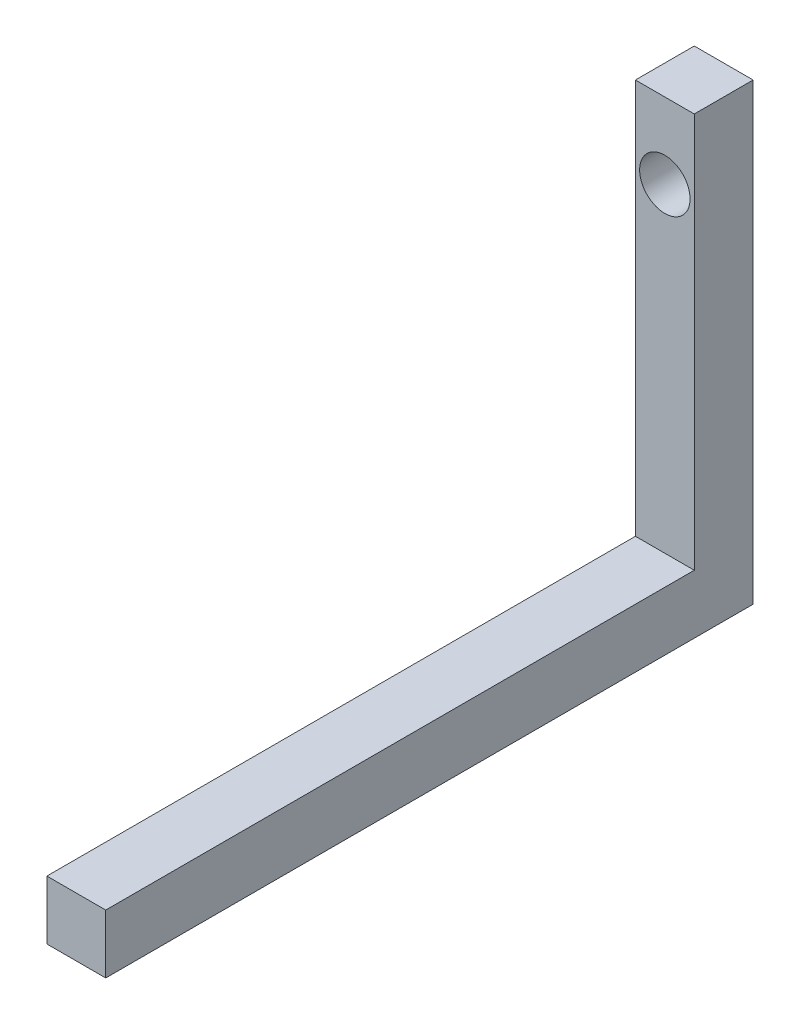
ISO-10303-21;
HEADER;
FILE_DESCRIPTION(('STEP AP214'),'2;1');
FILE_NAME('part.step','',(''),(''),'','','');
FILE_SCHEMA(('AUTOMOTIVE_DESIGN { 1 0 10303 214 1 1 1 1 }'));
ENDSEC;
DATA;
#1=APPLICATION_CONTEXT('core data for automotive mechanical design processes');
#2=APPLICATION_PROTOCOL_DEFINITION('international standard','automotive_design',2000,#1);
#3=PRODUCT_CONTEXT('',#1,'mechanical');
#4=PRODUCT('Part','Part','',(#3));
#5=PRODUCT_RELATED_PRODUCT_CATEGORY('part','',(#4));
#6=PRODUCT_DEFINITION_FORMATION('','',#4);
#7=PRODUCT_DEFINITION_CONTEXT('part definition',#1,'design');
#8=PRODUCT_DEFINITION('design','',#6,#7);
#9=PRODUCT_DEFINITION_SHAPE('','',#8);
#10=(LENGTH_UNIT() NAMED_UNIT(*) SI_UNIT(.MILLI.,.METRE.));
#11=(NAMED_UNIT(*) PLANE_ANGLE_UNIT() SI_UNIT($,.RADIAN.));
#12=(NAMED_UNIT(*) SI_UNIT($,.STERADIAN.) SOLID_ANGLE_UNIT());
#13=UNCERTAINTY_MEASURE_WITH_UNIT(LENGTH_MEASURE(1.E-05),#10,'distance_accuracy_value','');
#14=(GEOMETRIC_REPRESENTATION_CONTEXT(3) GLOBAL_UNCERTAINTY_ASSIGNED_CONTEXT((#13)) GLOBAL_UNIT_ASSIGNED_CONTEXT((#10,
#11,#12)) REPRESENTATION_CONTEXT('',''));
#15=CARTESIAN_POINT('',(0.,0.,0.));
#16=DIRECTION('',(0.,0.,1.));
#17=DIRECTION('',(1.,0.,0.));
#18=AXIS2_PLACEMENT_3D('',#15,#16,#17);
#19=CARTESIAN_POINT('',(-17.5,17.5,385.));
#20=DIRECTION('',(0.,-1.,0.));
#21=DIRECTION('',(0.,0.,-1.));
#22=AXIS2_PLACEMENT_3D('',#19,#20,#21);
#23=PLANE('',#22);
#24=DIRECTION('',(1.,0.,0.));
#25=VECTOR('',#24,1.);
#26=CARTESIAN_POINT('',(-17.5,17.5,35.));
#27=LINE('',#26,#25);
#28=CARTESIAN_POINT('',(-17.5,17.5,35.));
#29=VERTEX_POINT('',#28);
#30=CARTESIAN_POINT('',(17.5,17.5,35.));
#31=VERTEX_POINT('',#30);
#32=EDGE_CURVE('E54',#29,#31,#27,.T.);
#33=ORIENTED_EDGE('',*,*,#32,.F.);
#34=DIRECTION('',(0.,0.,-1.));
#35=VECTOR('',#34,1.);
#36=CARTESIAN_POINT('',(-17.5,17.5,385.));
#37=LINE('',#36,#35);
#38=CARTESIAN_POINT('',(-17.5,17.5,385.));
#39=VERTEX_POINT('',#38);
#40=EDGE_CURVE('E48',#39,#29,#37,.T.);
#41=ORIENTED_EDGE('',*,*,#40,.F.);
#42=DIRECTION('',(-1.,0.,0.));
#43=VECTOR('',#42,1.);
#44=CARTESIAN_POINT('',(-17.5,17.5,385.));
#45=LINE('',#44,#43);
#46=CARTESIAN_POINT('',(17.5,17.5,385.));
#47=VERTEX_POINT('',#46);
#48=EDGE_CURVE('E83',#47,#39,#45,.T.);
#49=ORIENTED_EDGE('',*,*,#48,.F.);
#50=DIRECTION('',(0.,0.,-1.));
#51=VECTOR('',#50,1.);
#52=CARTESIAN_POINT('',(17.5,17.5,385.));
#53=LINE('',#52,#51);
#54=EDGE_CURVE('E11',#47,#31,#53,.T.);
#55=ORIENTED_EDGE('',*,*,#54,.T.);
#56=EDGE_LOOP('',(#33,#41,#49,#55));
#57=FACE_BOUND('',#56,.T.);
#58=ADVANCED_FACE('F39',(#57),#23,.F.);
#59=CARTESIAN_POINT('',(17.5,-17.5,385.));
#60=DIRECTION('',(-1.,0.,0.));
#61=DIRECTION('',(0.,0.,1.));
#62=AXIS2_PLACEMENT_3D('',#59,#60,#61);
#63=PLANE('',#62);
#64=DIRECTION('',(0.,1.,0.));
#65=VECTOR('',#64,1.);
#66=CARTESIAN_POINT('',(17.5,-17.5,0.));
#67=LINE('',#66,#65);
#68=CARTESIAN_POINT('',(17.5,-17.5,0.));
#69=VERTEX_POINT('',#68);
#70=CARTESIAN_POINT('',(17.5,252.5,0.));
#71=VERTEX_POINT('',#70);
#72=EDGE_CURVE('E125',#69,#71,#67,.T.);
#73=ORIENTED_EDGE('',*,*,#72,.T.);
#74=DIRECTION('',(0.,0.,-1.));
#75=VECTOR('',#74,1.);
#76=CARTESIAN_POINT('',(17.5,252.5,0.));
#77=LINE('',#76,#75);
#78=CARTESIAN_POINT('',(17.5,252.5,35.));
#79=VERTEX_POINT('',#78);
#80=EDGE_CURVE('E111',#79,#71,#77,.T.);
#81=ORIENTED_EDGE('',*,*,#80,.F.);
#82=DIRECTION('',(0.,-1.,0.));
#83=VECTOR('',#82,1.);
#84=CARTESIAN_POINT('',(17.5,252.5,35.));
#85=LINE('',#84,#83);
#86=EDGE_CURVE('E106',#79,#31,#85,.T.);
#87=ORIENTED_EDGE('',*,*,#86,.T.);
#88=ORIENTED_EDGE('',*,*,#54,.F.);
#89=DIRECTION('',(0.,1.,0.));
#90=VECTOR('',#89,1.);
#91=CARTESIAN_POINT('',(17.5,-17.5,385.));
#92=LINE('',#91,#90);
#93=CARTESIAN_POINT('',(17.5,-17.5,385.));
#94=VERTEX_POINT('',#93);
#95=EDGE_CURVE('E134',#94,#47,#92,.T.);
#96=ORIENTED_EDGE('',*,*,#95,.F.);
#97=DIRECTION('',(0.,0.,-1.));
#98=VECTOR('',#97,1.);
#99=CARTESIAN_POINT('',(17.5,-17.5,385.));
#100=LINE('',#99,#98);
#101=EDGE_CURVE('E143',#94,#69,#100,.T.);
#102=ORIENTED_EDGE('',*,*,#101,.T.);
#103=EDGE_LOOP('',(#73,#81,#87,#88,#96,#102));
#104=FACE_BOUND('',#103,.T.);
#105=ADVANCED_FACE('F41',(#104),#63,.F.);
#106=CARTESIAN_POINT('',(-17.5,-17.5,385.));
#107=DIRECTION('',(1.,0.,0.));
#108=DIRECTION('',(0.,0.,-1.));
#109=AXIS2_PLACEMENT_3D('',#106,#107,#108);
#110=PLANE('',#109);
#111=DIRECTION('',(0.,-1.,0.));
#112=VECTOR('',#111,1.);
#113=CARTESIAN_POINT('',(-17.5,-17.5,0.));
#114=LINE('',#113,#112);
#115=CARTESIAN_POINT('',(-17.5,252.5,0.));
#116=VERTEX_POINT('',#115);
#117=CARTESIAN_POINT('',(-17.5,-17.5,0.));
#118=VERTEX_POINT('',#117);
#119=EDGE_CURVE('E129',#116,#118,#114,.T.);
#120=ORIENTED_EDGE('',*,*,#119,.T.);
#121=DIRECTION('',(0.,0.,-1.));
#122=VECTOR('',#121,1.);
#123=CARTESIAN_POINT('',(-17.5,-17.5,385.));
#124=LINE('',#123,#122);
#125=CARTESIAN_POINT('',(-17.5,-17.5,385.));
#126=VERTEX_POINT('',#125);
#127=EDGE_CURVE('E151',#126,#118,#124,.T.);
#128=ORIENTED_EDGE('',*,*,#127,.F.);
#129=DIRECTION('',(0.,-1.,0.));
#130=VECTOR('',#129,1.);
#131=CARTESIAN_POINT('',(-17.5,-17.5,385.));
#132=LINE('',#131,#130);
#133=EDGE_CURVE('E139',#39,#126,#132,.T.);
#134=ORIENTED_EDGE('',*,*,#133,.F.);
#135=ORIENTED_EDGE('',*,*,#40,.T.);
#136=DIRECTION('',(0.,-1.,0.));
#137=VECTOR('',#136,1.);
#138=CARTESIAN_POINT('',(-17.5,252.5,35.));
#139=LINE('',#138,#137);
#140=CARTESIAN_POINT('',(-17.5,252.5,35.));
#141=VERTEX_POINT('',#140);
#142=EDGE_CURVE('E104',#141,#29,#139,.T.);
#143=ORIENTED_EDGE('',*,*,#142,.F.);
#144=DIRECTION('',(0.,0.,1.));
#145=VECTOR('',#144,1.);
#146=CARTESIAN_POINT('',(-17.5,252.5,0.));
#147=LINE('',#146,#145);
#148=EDGE_CURVE('E112',#116,#141,#147,.T.);
#149=ORIENTED_EDGE('',*,*,#148,.F.);
#150=EDGE_LOOP('',(#120,#128,#134,#135,#143,#149));
#151=FACE_BOUND('',#150,.T.);
#152=ADVANCED_FACE('F122',(#151),#110,.F.);
#153=CARTESIAN_POINT('',(-17.5,-17.5,385.));
#154=DIRECTION('',(0.,1.,0.));
#155=DIRECTION('',(0.,0.,1.));
#156=AXIS2_PLACEMENT_3D('',#153,#154,#155);
#157=PLANE('',#156);
#158=DIRECTION('',(1.,0.,0.));
#159=VECTOR('',#158,1.);
#160=CARTESIAN_POINT('',(-17.5,-17.5,0.));
#161=LINE('',#160,#159);
#162=EDGE_CURVE('E78',#118,#69,#161,.T.);
#163=ORIENTED_EDGE('',*,*,#162,.T.);
#164=ORIENTED_EDGE('',*,*,#101,.F.);
#165=DIRECTION('',(1.,0.,0.));
#166=VECTOR('',#165,1.);
#167=CARTESIAN_POINT('',(-17.5,-17.5,385.));
#168=LINE('',#167,#166);
#169=EDGE_CURVE('E63',#126,#94,#168,.T.);
#170=ORIENTED_EDGE('',*,*,#169,.F.);
#171=ORIENTED_EDGE('',*,*,#127,.T.);
#172=EDGE_LOOP('',(#163,#164,#170,#171));
#173=FACE_BOUND('',#172,.T.);
#174=ADVANCED_FACE('F155',(#173),#157,.F.);
#175=CARTESIAN_POINT('',(0.,0.,385.));
#176=DIRECTION('',(0.,0.,-1.));
#177=DIRECTION('',(-1.,0.,0.));
#178=AXIS2_PLACEMENT_3D('',#175,#176,#177);
#179=PLANE('',#178);
#180=ORIENTED_EDGE('',*,*,#95,.T.);
#181=ORIENTED_EDGE('',*,*,#48,.T.);
#182=ORIENTED_EDGE('',*,*,#133,.T.);
#183=ORIENTED_EDGE('',*,*,#169,.T.);
#184=EDGE_LOOP('',(#180,#181,#182,#183));
#185=FACE_BOUND('',#184,.T.);
#186=ADVANCED_FACE('F181',(#185),#179,.F.);
#187=CARTESIAN_POINT('',(0.,0.,0.));
#188=DIRECTION('',(0.,0.,-1.));
#189=DIRECTION('',(-1.,0.,0.));
#190=AXIS2_PLACEMENT_3D('',#187,#188,#189);
#191=PLANE('',#190);
#192=CARTESIAN_POINT('',(0.,207.5,0.));
#193=DIRECTION('',(0.,0.,-1.));
#194=DIRECTION('',(-1.,0.,0.));
#195=AXIS2_PLACEMENT_3D('',#192,#193,#194);
#196=CIRCLE('',#195,15.);
#197=CARTESIAN_POINT('',(-15.,207.5,0.));
#198=VERTEX_POINT('',#197);
#199=EDGE_CURVE('E169',#198,#198,#196,.T.);
#200=ORIENTED_EDGE('',*,*,#199,.F.);
#201=EDGE_LOOP('',(#200));
#202=FACE_BOUND('',#201,.T.);
#203=ORIENTED_EDGE('',*,*,#72,.F.);
#204=ORIENTED_EDGE('',*,*,#162,.F.);
#205=ORIENTED_EDGE('',*,*,#119,.F.);
#206=DIRECTION('',(-1.,0.,0.));
#207=VECTOR('',#206,1.);
#208=CARTESIAN_POINT('',(-17.5,252.5,0.));
#209=LINE('',#208,#207);
#210=EDGE_CURVE('E118',#71,#116,#209,.T.);
#211=ORIENTED_EDGE('',*,*,#210,.F.);
#212=EDGE_LOOP('',(#203,#204,#205,#211));
#213=FACE_BOUND('',#212,.T.);
#214=ADVANCED_FACE('F158',(#202,#213),#191,.T.);
#215=CARTESIAN_POINT('',(-17.5,252.5,35.));
#216=DIRECTION('',(0.,0.,-1.));
#217=DIRECTION('',(-1.,0.,0.));
#218=AXIS2_PLACEMENT_3D('',#215,#216,#217);
#219=PLANE('',#218);
#220=CARTESIAN_POINT('',(0.,207.5,35.));
#221=DIRECTION('',(0.,0.,-1.));
#222=DIRECTION('',(-1.,0.,0.));
#223=AXIS2_PLACEMENT_3D('',#220,#221,#222);
#224=CIRCLE('',#223,15.);
#225=CARTESIAN_POINT('',(-15.,207.5,35.));
#226=VERTEX_POINT('',#225);
#227=EDGE_CURVE('E166',#226,#226,#224,.T.);
#228=ORIENTED_EDGE('',*,*,#227,.T.);
#229=EDGE_LOOP('',(#228));
#230=FACE_BOUND('',#229,.T.);
#231=ORIENTED_EDGE('',*,*,#32,.T.);
#232=ORIENTED_EDGE('',*,*,#86,.F.);
#233=DIRECTION('',(1.,0.,0.));
#234=VECTOR('',#233,1.);
#235=CARTESIAN_POINT('',(-17.5,252.5,35.));
#236=LINE('',#235,#234);
#237=EDGE_CURVE('E100',#141,#79,#236,.T.);
#238=ORIENTED_EDGE('',*,*,#237,.F.);
#239=ORIENTED_EDGE('',*,*,#142,.T.);
#240=EDGE_LOOP('',(#231,#232,#238,#239));
#241=FACE_BOUND('',#240,.T.);
#242=ADVANCED_FACE('F102',(#230,#241),#219,.F.);
#243=CARTESIAN_POINT('',(0.,252.5,0.));
#244=DIRECTION('',(0.,1.,0.));
#245=DIRECTION('',(0.,0.,1.));
#246=AXIS2_PLACEMENT_3D('',#243,#244,#245);
#247=PLANE('',#246);
#248=ORIENTED_EDGE('',*,*,#148,.T.);
#249=ORIENTED_EDGE('',*,*,#237,.T.);
#250=ORIENTED_EDGE('',*,*,#80,.T.);
#251=ORIENTED_EDGE('',*,*,#210,.T.);
#252=EDGE_LOOP('',(#248,#249,#250,#251));
#253=FACE_BOUND('',#252,.T.);
#254=ADVANCED_FACE('F116',(#253),#247,.T.);
#255=CARTESIAN_POINT('',(0.,207.5,35.));
#256=DIRECTION('',(0.,0.,-1.));
#257=DIRECTION('',(-1.,0.,0.));
#258=AXIS2_PLACEMENT_3D('',#255,#256,#257);
#259=CYLINDRICAL_SURFACE('',#258,15.);
#260=ORIENTED_EDGE('',*,*,#227,.F.);
#261=EDGE_LOOP('',(#260));
#262=FACE_BOUND('',#261,.T.);
#263=ORIENTED_EDGE('',*,*,#199,.T.);
#264=EDGE_LOOP('',(#263));
#265=FACE_BOUND('',#264,.T.);
#266=ADVANCED_FACE('F178',(#262,#265),#259,.F.);
#267=CLOSED_SHELL('',(#58,#105,#152,#174,#186,#214,#242,#254,#266));
#268=MANIFOLD_SOLID_BREP('B2',#267);
#269=ADVANCED_BREP_SHAPE_REPRESENTATION('',(#18,#268),#14);
#270=SHAPE_DEFINITION_REPRESENTATION(#9,#269);
ENDSEC;
END-ISO-10303-21;
